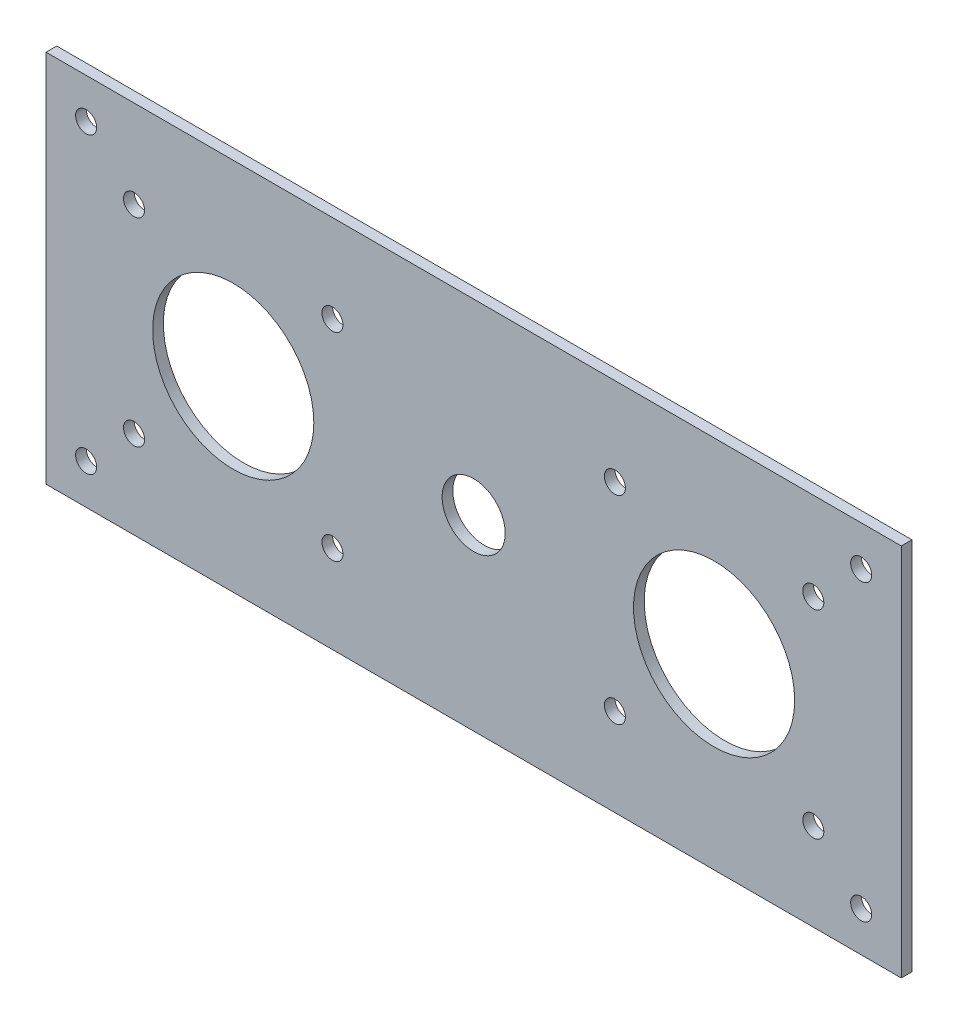
ISO-10303-21;
HEADER;
FILE_DESCRIPTION(('STEP AP214'),'2;1');
FILE_NAME('part.step','',(''),(''),'','','');
FILE_SCHEMA(('AUTOMOTIVE_DESIGN { 1 0 10303 214 1 1 1 1 }'));
ENDSEC;
DATA;
#1=APPLICATION_CONTEXT('core data for automotive mechanical design processes');
#2=APPLICATION_PROTOCOL_DEFINITION('international standard','automotive_design',2000,#1);
#3=PRODUCT_CONTEXT('',#1,'mechanical');
#4=PRODUCT('Part','Part','',(#3));
#5=PRODUCT_RELATED_PRODUCT_CATEGORY('part','',(#4));
#6=PRODUCT_DEFINITION_FORMATION('','',#4);
#7=PRODUCT_DEFINITION_CONTEXT('part definition',#1,'design');
#8=PRODUCT_DEFINITION('design','',#6,#7);
#9=PRODUCT_DEFINITION_SHAPE('','',#8);
#10=(LENGTH_UNIT() NAMED_UNIT(*) SI_UNIT(.MILLI.,.METRE.));
#11=(NAMED_UNIT(*) PLANE_ANGLE_UNIT() SI_UNIT($,.RADIAN.));
#12=(NAMED_UNIT(*) SI_UNIT($,.STERADIAN.) SOLID_ANGLE_UNIT());
#13=UNCERTAINTY_MEASURE_WITH_UNIT(LENGTH_MEASURE(1.E-05),#10,'distance_accuracy_value','');
#14=(GEOMETRIC_REPRESENTATION_CONTEXT(3) GLOBAL_UNCERTAINTY_ASSIGNED_CONTEXT((#13)) GLOBAL_UNIT_ASSIGNED_CONTEXT((#10,
#11,#12)) REPRESENTATION_CONTEXT('',''));
#15=CARTESIAN_POINT('',(0.,0.,0.));
#16=DIRECTION('',(0.,0.,1.));
#17=DIRECTION('',(1.,0.,0.));
#18=AXIS2_PLACEMENT_3D('',#15,#16,#17);
#19=CARTESIAN_POINT('',(0.,0.,1.27));
#20=DIRECTION('',(0.,0.,-1.));
#21=DIRECTION('',(-1.,0.,0.));
#22=AXIS2_PLACEMENT_3D('',#19,#20,#21);
#23=PLANE('',#22);
#24=CARTESIAN_POINT('',(0.,0.,1.27));
#25=DIRECTION('',(0.,0.,-1.));
#26=DIRECTION('',(-1.,0.,0.));
#27=AXIS2_PLACEMENT_3D('',#24,#25,#26);
#28=CIRCLE('',#27,7.50000000000001);
#29=CARTESIAN_POINT('',(-7.50000000000001,0.,1.27));
#30=VERTEX_POINT('',#29);
#31=EDGE_CURVE('E238',#30,#30,#28,.T.);
#32=ORIENTED_EDGE('',*,*,#31,.T.);
#33=EDGE_LOOP('',(#32));
#34=FACE_BOUND('',#33,.T.);
#35=CARTESIAN_POINT('',(-92.075,34.925,1.27));
#36=DIRECTION('',(0.,0.,1.));
#37=DIRECTION('',(1.,0.,0.));
#38=AXIS2_PLACEMENT_3D('',#35,#36,#37);
#39=CIRCLE('',#38,2.5);
#40=CARTESIAN_POINT('',(-89.575,34.925,1.27));
#41=VERTEX_POINT('',#40);
#42=EDGE_CURVE('E227',#41,#41,#39,.T.);
#43=ORIENTED_EDGE('',*,*,#42,.F.);
#44=EDGE_LOOP('',(#43));
#45=FACE_BOUND('',#44,.T.);
#46=CARTESIAN_POINT('',(92.075,-34.925,1.27));
#47=DIRECTION('',(0.,0.,1.));
#48=DIRECTION('',(1.,0.,0.));
#49=AXIS2_PLACEMENT_3D('',#46,#47,#48);
#50=CIRCLE('',#49,2.5);
#51=CARTESIAN_POINT('',(94.575,-34.925,1.27));
#52=VERTEX_POINT('',#51);
#53=EDGE_CURVE('E218',#52,#52,#50,.T.);
#54=ORIENTED_EDGE('',*,*,#53,.F.);
#55=EDGE_LOOP('',(#54));
#56=FACE_BOUND('',#55,.T.);
#57=CARTESIAN_POINT('',(92.075,34.925,1.27));
#58=DIRECTION('',(0.,0.,1.));
#59=DIRECTION('',(1.,0.,0.));
#60=AXIS2_PLACEMENT_3D('',#57,#58,#59);
#61=CIRCLE('',#60,2.50000000000001);
#62=CARTESIAN_POINT('',(94.575,34.925,1.27));
#63=VERTEX_POINT('',#62);
#64=EDGE_CURVE('E234',#63,#63,#61,.T.);
#65=ORIENTED_EDGE('',*,*,#64,.F.);
#66=EDGE_LOOP('',(#65));
#67=FACE_BOUND('',#66,.T.);
#68=CARTESIAN_POINT('',(-92.075,-34.925,1.27));
#69=DIRECTION('',(0.,0.,1.));
#70=DIRECTION('',(1.,0.,0.));
#71=AXIS2_PLACEMENT_3D('',#68,#69,#70);
#72=CIRCLE('',#71,2.5);
#73=CARTESIAN_POINT('',(-89.575,-34.925,1.27));
#74=VERTEX_POINT('',#73);
#75=EDGE_CURVE('E210',#74,#74,#72,.T.);
#76=ORIENTED_EDGE('',*,*,#75,.F.);
#77=EDGE_LOOP('',(#76));
#78=FACE_BOUND('',#77,.T.);
#79=DIRECTION('',(0.,1.,0.));
#80=VECTOR('',#79,1.);
#81=CARTESIAN_POINT('',(101.6,-44.45,1.27));
#82=LINE('',#81,#80);
#83=CARTESIAN_POINT('',(101.6,-44.45,1.27));
#84=VERTEX_POINT('',#83);
#85=CARTESIAN_POINT('',(101.6,44.45,1.27));
#86=VERTEX_POINT('',#85);
#87=EDGE_CURVE('E92',#84,#86,#82,.T.);
#88=ORIENTED_EDGE('',*,*,#87,.T.);
#89=DIRECTION('',(-1.,0.,0.));
#90=VECTOR('',#89,1.);
#91=CARTESIAN_POINT('',(-101.6,44.45,1.27));
#92=LINE('',#91,#90);
#93=CARTESIAN_POINT('',(-101.6,44.45,1.27));
#94=VERTEX_POINT('',#93);
#95=EDGE_CURVE('E87',#86,#94,#92,.T.);
#96=ORIENTED_EDGE('',*,*,#95,.T.);
#97=DIRECTION('',(0.,-1.,0.));
#98=VECTOR('',#97,1.);
#99=CARTESIAN_POINT('',(-101.6,-44.45,1.27));
#100=LINE('',#99,#98);
#101=CARTESIAN_POINT('',(-101.6,-44.45,1.27));
#102=VERTEX_POINT('',#101);
#103=EDGE_CURVE('E90',#94,#102,#100,.T.);
#104=ORIENTED_EDGE('',*,*,#103,.T.);
#105=DIRECTION('',(1.,0.,0.));
#106=VECTOR('',#105,1.);
#107=CARTESIAN_POINT('',(-101.6,-44.45,1.27));
#108=LINE('',#107,#106);
#109=EDGE_CURVE('E57',#102,#84,#108,.T.);
#110=ORIENTED_EDGE('',*,*,#109,.T.);
#111=EDGE_LOOP('',(#88,#96,#104,#110));
#112=FACE_BOUND('',#111,.T.);
#113=CARTESIAN_POINT('',(-80.695,-23.57,1.27));
#114=DIRECTION('',(0.,0.,1.));
#115=DIRECTION('',(1.,0.,0.));
#116=AXIS2_PLACEMENT_3D('',#113,#114,#115);
#117=CIRCLE('',#116,2.50000000000002);
#118=CARTESIAN_POINT('',(-78.195,-23.57,1.27));
#119=VERTEX_POINT('',#118);
#120=EDGE_CURVE('E112',#119,#119,#117,.T.);
#121=ORIENTED_EDGE('',*,*,#120,.F.);
#122=EDGE_LOOP('',(#121));
#123=FACE_BOUND('',#122,.T.);
#124=CARTESIAN_POINT('',(-33.555,-23.57,1.27));
#125=DIRECTION('',(0.,0.,1.));
#126=DIRECTION('',(1.,0.,0.));
#127=AXIS2_PLACEMENT_3D('',#124,#125,#126);
#128=CIRCLE('',#127,2.50000000000002);
#129=CARTESIAN_POINT('',(-31.055,-23.57,1.27));
#130=VERTEX_POINT('',#129);
#131=EDGE_CURVE('E134',#130,#130,#128,.T.);
#132=ORIENTED_EDGE('',*,*,#131,.F.);
#133=EDGE_LOOP('',(#132));
#134=FACE_BOUND('',#133,.T.);
#135=CARTESIAN_POINT('',(-33.555,23.57,1.27));
#136=DIRECTION('',(0.,0.,1.));
#137=DIRECTION('',(1.,0.,0.));
#138=AXIS2_PLACEMENT_3D('',#135,#136,#137);
#139=CIRCLE('',#138,2.50000000000002);
#140=CARTESIAN_POINT('',(-31.055,23.57,1.27));
#141=VERTEX_POINT('',#140);
#142=EDGE_CURVE('E142',#141,#141,#139,.T.);
#143=ORIENTED_EDGE('',*,*,#142,.F.);
#144=EDGE_LOOP('',(#143));
#145=FACE_BOUND('',#144,.T.);
#146=CARTESIAN_POINT('',(-80.695,23.57,1.27));
#147=DIRECTION('',(0.,0.,1.));
#148=DIRECTION('',(1.,0.,0.));
#149=AXIS2_PLACEMENT_3D('',#146,#147,#148);
#150=CIRCLE('',#149,2.50000000000002);
#151=CARTESIAN_POINT('',(-78.195,23.57,1.27));
#152=VERTEX_POINT('',#151);
#153=EDGE_CURVE('E150',#152,#152,#150,.T.);
#154=ORIENTED_EDGE('',*,*,#153,.F.);
#155=EDGE_LOOP('',(#154));
#156=FACE_BOUND('',#155,.T.);
#157=CARTESIAN_POINT('',(80.695,23.57,1.27));
#158=DIRECTION('',(0.,0.,1.));
#159=DIRECTION('',(1.,0.,0.));
#160=AXIS2_PLACEMENT_3D('',#157,#158,#159);
#161=CIRCLE('',#160,2.50000000000001);
#162=CARTESIAN_POINT('',(83.195,23.57,1.27));
#163=VERTEX_POINT('',#162);
#164=EDGE_CURVE('E158',#163,#163,#161,.T.);
#165=ORIENTED_EDGE('',*,*,#164,.F.);
#166=EDGE_LOOP('',(#165));
#167=FACE_BOUND('',#166,.T.);
#168=CARTESIAN_POINT('',(33.555,23.57,1.27));
#169=DIRECTION('',(0.,0.,1.));
#170=DIRECTION('',(1.,0.,0.));
#171=AXIS2_PLACEMENT_3D('',#168,#169,#170);
#172=CIRCLE('',#171,2.49999999999999);
#173=CARTESIAN_POINT('',(36.055,23.57,1.27));
#174=VERTEX_POINT('',#173);
#175=EDGE_CURVE('E166',#174,#174,#172,.T.);
#176=ORIENTED_EDGE('',*,*,#175,.F.);
#177=EDGE_LOOP('',(#176));
#178=FACE_BOUND('',#177,.T.);
#179=CARTESIAN_POINT('',(80.695,-23.57,1.27));
#180=DIRECTION('',(0.,0.,1.));
#181=DIRECTION('',(1.,0.,0.));
#182=AXIS2_PLACEMENT_3D('',#179,#180,#181);
#183=CIRCLE('',#182,2.5);
#184=CARTESIAN_POINT('',(83.195,-23.57,1.27));
#185=VERTEX_POINT('',#184);
#186=EDGE_CURVE('E174',#185,#185,#183,.T.);
#187=ORIENTED_EDGE('',*,*,#186,.F.);
#188=EDGE_LOOP('',(#187));
#189=FACE_BOUND('',#188,.T.);
#190=CARTESIAN_POINT('',(33.555,-23.57,1.27));
#191=DIRECTION('',(0.,0.,1.));
#192=DIRECTION('',(1.,0.,0.));
#193=AXIS2_PLACEMENT_3D('',#190,#191,#192);
#194=CIRCLE('',#193,2.49999999999999);
#195=CARTESIAN_POINT('',(36.055,-23.57,1.27));
#196=VERTEX_POINT('',#195);
#197=EDGE_CURVE('E182',#196,#196,#194,.T.);
#198=ORIENTED_EDGE('',*,*,#197,.F.);
#199=EDGE_LOOP('',(#198));
#200=FACE_BOUND('',#199,.T.);
#201=CARTESIAN_POINT('',(-57.125,0.,1.27));
#202=DIRECTION('',(0.,0.,1.));
#203=DIRECTION('',(1.,0.,0.));
#204=AXIS2_PLACEMENT_3D('',#201,#202,#203);
#205=CIRCLE('',#204,19.15);
#206=CARTESIAN_POINT('',(-37.975,0.,1.27));
#207=VERTEX_POINT('',#206);
#208=EDGE_CURVE('E190',#207,#207,#205,.T.);
#209=ORIENTED_EDGE('',*,*,#208,.F.);
#210=EDGE_LOOP('',(#209));
#211=FACE_BOUND('',#210,.T.);
#212=CARTESIAN_POINT('',(57.125,0.,1.27));
#213=DIRECTION('',(0.,0.,1.));
#214=DIRECTION('',(1.,0.,0.));
#215=AXIS2_PLACEMENT_3D('',#212,#213,#214);
#216=CIRCLE('',#215,19.15);
#217=CARTESIAN_POINT('',(76.275,0.,1.27));
#218=VERTEX_POINT('',#217);
#219=EDGE_CURVE('E198',#218,#218,#216,.T.);
#220=ORIENTED_EDGE('',*,*,#219,.F.);
#221=EDGE_LOOP('',(#220));
#222=FACE_BOUND('',#221,.T.);
#223=ADVANCED_FACE('F39',(#34,#45,#56,#67,#78,#112,#123,#134,#145,#156,#167,#178,#189,#200,#211,
#222),#23,.F.);
#224=CARTESIAN_POINT('',(0.,0.,-1.27));
#225=DIRECTION('',(0.,0.,-1.));
#226=DIRECTION('',(-1.,0.,0.));
#227=AXIS2_PLACEMENT_3D('',#224,#225,#226);
#228=PLANE('',#227);
#229=CARTESIAN_POINT('',(0.,0.,-1.27));
#230=DIRECTION('',(0.,0.,1.));
#231=DIRECTION('',(1.,0.,0.));
#232=AXIS2_PLACEMENT_3D('',#229,#230,#231);
#233=CIRCLE('',#232,7.50000000000001);
#234=CARTESIAN_POINT('',(7.50000000000001,0.,-1.27));
#235=VERTEX_POINT('',#234);
#236=EDGE_CURVE('E245',#235,#235,#233,.T.);
#237=ORIENTED_EDGE('',*,*,#236,.T.);
#238=EDGE_LOOP('',(#237));
#239=FACE_BOUND('',#238,.T.);
#240=CARTESIAN_POINT('',(-92.075,34.925,-1.27));
#241=DIRECTION('',(0.,0.,1.));
#242=DIRECTION('',(1.,0.,0.));
#243=AXIS2_PLACEMENT_3D('',#240,#241,#242);
#244=CIRCLE('',#243,2.5);
#245=CARTESIAN_POINT('',(-89.575,34.925,-1.27));
#246=VERTEX_POINT('',#245);
#247=EDGE_CURVE('E214',#246,#246,#244,.T.);
#248=ORIENTED_EDGE('',*,*,#247,.T.);
#249=EDGE_LOOP('',(#248));
#250=FACE_BOUND('',#249,.T.);
#251=CARTESIAN_POINT('',(92.075,-34.925,-1.27));
#252=DIRECTION('',(0.,0.,1.));
#253=DIRECTION('',(1.,0.,0.));
#254=AXIS2_PLACEMENT_3D('',#251,#252,#253);
#255=CIRCLE('',#254,2.5);
#256=CARTESIAN_POINT('',(94.575,-34.925,-1.27));
#257=VERTEX_POINT('',#256);
#258=EDGE_CURVE('E222',#257,#257,#255,.T.);
#259=ORIENTED_EDGE('',*,*,#258,.T.);
#260=EDGE_LOOP('',(#259));
#261=FACE_BOUND('',#260,.T.);
#262=CARTESIAN_POINT('',(92.075,34.925,-1.27));
#263=DIRECTION('',(0.,0.,1.));
#264=DIRECTION('',(1.,0.,0.));
#265=AXIS2_PLACEMENT_3D('',#262,#263,#264);
#266=CIRCLE('',#265,2.50000000000001);
#267=CARTESIAN_POINT('',(94.575,34.925,-1.27));
#268=VERTEX_POINT('',#267);
#269=EDGE_CURVE('E223',#268,#268,#266,.T.);
#270=ORIENTED_EDGE('',*,*,#269,.T.);
#271=EDGE_LOOP('',(#270));
#272=FACE_BOUND('',#271,.T.);
#273=CARTESIAN_POINT('',(-92.075,-34.925,-1.27));
#274=DIRECTION('',(0.,0.,1.));
#275=DIRECTION('',(1.,0.,0.));
#276=AXIS2_PLACEMENT_3D('',#273,#274,#275);
#277=CIRCLE('',#276,2.5);
#278=CARTESIAN_POINT('',(-89.575,-34.925,-1.27));
#279=VERTEX_POINT('',#278);
#280=EDGE_CURVE('E206',#279,#279,#277,.T.);
#281=ORIENTED_EDGE('',*,*,#280,.T.);
#282=EDGE_LOOP('',(#281));
#283=FACE_BOUND('',#282,.T.);
#284=CARTESIAN_POINT('',(-57.125,0.,-1.27));
#285=DIRECTION('',(0.,0.,1.));
#286=DIRECTION('',(1.,0.,0.));
#287=AXIS2_PLACEMENT_3D('',#284,#285,#286);
#288=CIRCLE('',#287,19.15);
#289=CARTESIAN_POINT('',(-37.975,0.,-1.27));
#290=VERTEX_POINT('',#289);
#291=EDGE_CURVE('E194',#290,#290,#288,.T.);
#292=ORIENTED_EDGE('',*,*,#291,.T.);
#293=EDGE_LOOP('',(#292));
#294=FACE_BOUND('',#293,.T.);
#295=CARTESIAN_POINT('',(80.695,-23.57,-1.27));
#296=DIRECTION('',(0.,0.,1.));
#297=DIRECTION('',(1.,0.,0.));
#298=AXIS2_PLACEMENT_3D('',#295,#296,#297);
#299=CIRCLE('',#298,2.5);
#300=CARTESIAN_POINT('',(83.195,-23.57,-1.27));
#301=VERTEX_POINT('',#300);
#302=EDGE_CURVE('E178',#301,#301,#299,.T.);
#303=ORIENTED_EDGE('',*,*,#302,.T.);
#304=EDGE_LOOP('',(#303));
#305=FACE_BOUND('',#304,.T.);
#306=CARTESIAN_POINT('',(80.695,23.57,-1.27));
#307=DIRECTION('',(0.,0.,1.));
#308=DIRECTION('',(1.,0.,0.));
#309=AXIS2_PLACEMENT_3D('',#306,#307,#308);
#310=CIRCLE('',#309,2.50000000000001);
#311=CARTESIAN_POINT('',(83.195,23.57,-1.27));
#312=VERTEX_POINT('',#311);
#313=EDGE_CURVE('E162',#312,#312,#310,.T.);
#314=ORIENTED_EDGE('',*,*,#313,.T.);
#315=EDGE_LOOP('',(#314));
#316=FACE_BOUND('',#315,.T.);
#317=CARTESIAN_POINT('',(-33.555,23.57,-1.27));
#318=DIRECTION('',(0.,0.,1.));
#319=DIRECTION('',(1.,0.,0.));
#320=AXIS2_PLACEMENT_3D('',#317,#318,#319);
#321=CIRCLE('',#320,2.50000000000002);
#322=CARTESIAN_POINT('',(-31.055,23.57,-1.27));
#323=VERTEX_POINT('',#322);
#324=EDGE_CURVE('E146',#323,#323,#321,.T.);
#325=ORIENTED_EDGE('',*,*,#324,.T.);
#326=EDGE_LOOP('',(#325));
#327=FACE_BOUND('',#326,.T.);
#328=CARTESIAN_POINT('',(-80.695,-23.57,-1.27));
#329=DIRECTION('',(0.,0.,1.));
#330=DIRECTION('',(1.,0.,0.));
#331=AXIS2_PLACEMENT_3D('',#328,#329,#330);
#332=CIRCLE('',#331,2.50000000000002);
#333=CARTESIAN_POINT('',(-78.195,-23.57,-1.27));
#334=VERTEX_POINT('',#333);
#335=EDGE_CURVE('E130',#334,#334,#332,.T.);
#336=ORIENTED_EDGE('',*,*,#335,.T.);
#337=EDGE_LOOP('',(#336));
#338=FACE_BOUND('',#337,.T.);
#339=DIRECTION('',(0.,1.,0.));
#340=VECTOR('',#339,1.);
#341=CARTESIAN_POINT('',(101.6,-44.45,-1.27));
#342=LINE('',#341,#340);
#343=CARTESIAN_POINT('',(101.6,-44.45,-1.27));
#344=VERTEX_POINT('',#343);
#345=CARTESIAN_POINT('',(101.6,44.45,-1.27));
#346=VERTEX_POINT('',#345);
#347=EDGE_CURVE('E108',#344,#346,#342,.T.);
#348=ORIENTED_EDGE('',*,*,#347,.F.);
#349=DIRECTION('',(1.,0.,0.));
#350=VECTOR('',#349,1.);
#351=CARTESIAN_POINT('',(-101.6,-44.45,-1.27));
#352=LINE('',#351,#350);
#353=CARTESIAN_POINT('',(-101.6,-44.45,-1.27));
#354=VERTEX_POINT('',#353);
#355=EDGE_CURVE('E80',#354,#344,#352,.T.);
#356=ORIENTED_EDGE('',*,*,#355,.F.);
#357=DIRECTION('',(0.,-1.,0.));
#358=VECTOR('',#357,1.);
#359=CARTESIAN_POINT('',(-101.6,-44.45,-1.27));
#360=LINE('',#359,#358);
#361=CARTESIAN_POINT('',(-101.6,44.45,-1.27));
#362=VERTEX_POINT('',#361);
#363=EDGE_CURVE('E74',#362,#354,#360,.T.);
#364=ORIENTED_EDGE('',*,*,#363,.F.);
#365=DIRECTION('',(-1.,0.,0.));
#366=VECTOR('',#365,1.);
#367=CARTESIAN_POINT('',(-101.6,44.45,-1.27));
#368=LINE('',#367,#366);
#369=EDGE_CURVE('E97',#346,#362,#368,.T.);
#370=ORIENTED_EDGE('',*,*,#369,.F.);
#371=EDGE_LOOP('',(#348,#356,#364,#370));
#372=FACE_BOUND('',#371,.T.);
#373=CARTESIAN_POINT('',(-33.555,-23.57,-1.27));
#374=DIRECTION('',(0.,0.,1.));
#375=DIRECTION('',(1.,0.,0.));
#376=AXIS2_PLACEMENT_3D('',#373,#374,#375);
#377=CIRCLE('',#376,2.50000000000002);
#378=CARTESIAN_POINT('',(-31.055,-23.57,-1.27));
#379=VERTEX_POINT('',#378);
#380=EDGE_CURVE('E138',#379,#379,#377,.T.);
#381=ORIENTED_EDGE('',*,*,#380,.T.);
#382=EDGE_LOOP('',(#381));
#383=FACE_BOUND('',#382,.T.);
#384=CARTESIAN_POINT('',(-80.695,23.57,-1.27));
#385=DIRECTION('',(0.,0.,1.));
#386=DIRECTION('',(1.,0.,0.));
#387=AXIS2_PLACEMENT_3D('',#384,#385,#386);
#388=CIRCLE('',#387,2.50000000000002);
#389=CARTESIAN_POINT('',(-78.195,23.57,-1.27));
#390=VERTEX_POINT('',#389);
#391=EDGE_CURVE('E154',#390,#390,#388,.T.);
#392=ORIENTED_EDGE('',*,*,#391,.T.);
#393=EDGE_LOOP('',(#392));
#394=FACE_BOUND('',#393,.T.);
#395=CARTESIAN_POINT('',(33.555,23.57,-1.27));
#396=DIRECTION('',(0.,0.,1.));
#397=DIRECTION('',(1.,0.,0.));
#398=AXIS2_PLACEMENT_3D('',#395,#396,#397);
#399=CIRCLE('',#398,2.49999999999999);
#400=CARTESIAN_POINT('',(36.055,23.57,-1.27));
#401=VERTEX_POINT('',#400);
#402=EDGE_CURVE('E170',#401,#401,#399,.T.);
#403=ORIENTED_EDGE('',*,*,#402,.T.);
#404=EDGE_LOOP('',(#403));
#405=FACE_BOUND('',#404,.T.);
#406=CARTESIAN_POINT('',(33.555,-23.57,-1.27));
#407=DIRECTION('',(0.,0.,1.));
#408=DIRECTION('',(1.,0.,0.));
#409=AXIS2_PLACEMENT_3D('',#406,#407,#408);
#410=CIRCLE('',#409,2.49999999999999);
#411=CARTESIAN_POINT('',(36.055,-23.57,-1.27));
#412=VERTEX_POINT('',#411);
#413=EDGE_CURVE('E186',#412,#412,#410,.T.);
#414=ORIENTED_EDGE('',*,*,#413,.T.);
#415=EDGE_LOOP('',(#414));
#416=FACE_BOUND('',#415,.T.);
#417=CARTESIAN_POINT('',(57.125,0.,-1.27));
#418=DIRECTION('',(0.,0.,1.));
#419=DIRECTION('',(1.,0.,0.));
#420=AXIS2_PLACEMENT_3D('',#417,#418,#419);
#421=CIRCLE('',#420,19.15);
#422=CARTESIAN_POINT('',(76.275,0.,-1.27));
#423=VERTEX_POINT('',#422);
#424=EDGE_CURVE('E202',#423,#423,#421,.T.);
#425=ORIENTED_EDGE('',*,*,#424,.T.);
#426=EDGE_LOOP('',(#425));
#427=FACE_BOUND('',#426,.T.);
#428=ADVANCED_FACE('F125',(#239,#250,#261,#272,#283,#294,#305,#316,#327,#338,#372,#383,#394,
#405,#416,#427),#228,.T.);
#429=CARTESIAN_POINT('',(101.6,-44.45,1.27));
#430=DIRECTION('',(-1.,0.,0.));
#431=DIRECTION('',(0.,0.,1.));
#432=AXIS2_PLACEMENT_3D('',#429,#430,#431);
#433=PLANE('',#432);
#434=ORIENTED_EDGE('',*,*,#347,.T.);
#435=DIRECTION('',(0.,0.,-1.));
#436=VECTOR('',#435,1.);
#437=CARTESIAN_POINT('',(101.6,44.45,1.27));
#438=LINE('',#437,#436);
#439=EDGE_CURVE('E11',#86,#346,#438,.T.);
#440=ORIENTED_EDGE('',*,*,#439,.F.);
#441=ORIENTED_EDGE('',*,*,#87,.F.);
#442=DIRECTION('',(0.,0.,-1.));
#443=VECTOR('',#442,1.);
#444=CARTESIAN_POINT('',(101.6,-44.45,1.27));
#445=LINE('',#444,#443);
#446=EDGE_CURVE('E104',#84,#344,#445,.T.);
#447=ORIENTED_EDGE('',*,*,#446,.T.);
#448=EDGE_LOOP('',(#434,#440,#441,#447));
#449=FACE_BOUND('',#448,.T.);
#450=ADVANCED_FACE('F41',(#449),#433,.F.);
#451=CARTESIAN_POINT('',(-101.6,44.45,1.27));
#452=DIRECTION('',(0.,-1.,0.));
#453=DIRECTION('',(0.,0.,-1.));
#454=AXIS2_PLACEMENT_3D('',#451,#452,#453);
#455=PLANE('',#454);
#456=ORIENTED_EDGE('',*,*,#369,.T.);
#457=DIRECTION('',(0.,0.,-1.));
#458=VECTOR('',#457,1.);
#459=CARTESIAN_POINT('',(-101.6,44.45,1.27));
#460=LINE('',#459,#458);
#461=EDGE_CURVE('E49',#94,#362,#460,.T.);
#462=ORIENTED_EDGE('',*,*,#461,.F.);
#463=ORIENTED_EDGE('',*,*,#95,.F.);
#464=ORIENTED_EDGE('',*,*,#439,.T.);
#465=EDGE_LOOP('',(#456,#462,#463,#464));
#466=FACE_BOUND('',#465,.T.);
#467=ADVANCED_FACE('F96',(#466),#455,.F.);
#468=CARTESIAN_POINT('',(-101.6,-44.45,1.27));
#469=DIRECTION('',(1.,0.,0.));
#470=DIRECTION('',(0.,0.,-1.));
#471=AXIS2_PLACEMENT_3D('',#468,#469,#470);
#472=PLANE('',#471);
#473=ORIENTED_EDGE('',*,*,#363,.T.);
#474=DIRECTION('',(0.,0.,-1.));
#475=VECTOR('',#474,1.);
#476=CARTESIAN_POINT('',(-101.6,-44.45,1.27));
#477=LINE('',#476,#475);
#478=EDGE_CURVE('E99',#102,#354,#477,.T.);
#479=ORIENTED_EDGE('',*,*,#478,.F.);
#480=ORIENTED_EDGE('',*,*,#103,.F.);
#481=ORIENTED_EDGE('',*,*,#461,.T.);
#482=EDGE_LOOP('',(#473,#479,#480,#481));
#483=FACE_BOUND('',#482,.T.);
#484=ADVANCED_FACE('F100',(#483),#472,.F.);
#485=CARTESIAN_POINT('',(-101.6,-44.45,1.27));
#486=DIRECTION('',(0.,1.,0.));
#487=DIRECTION('',(0.,0.,1.));
#488=AXIS2_PLACEMENT_3D('',#485,#486,#487);
#489=PLANE('',#488);
#490=ORIENTED_EDGE('',*,*,#355,.T.);
#491=ORIENTED_EDGE('',*,*,#446,.F.);
#492=ORIENTED_EDGE('',*,*,#109,.F.);
#493=ORIENTED_EDGE('',*,*,#478,.T.);
#494=EDGE_LOOP('',(#490,#491,#492,#493));
#495=FACE_BOUND('',#494,.T.);
#496=ADVANCED_FACE('F122',(#495),#489,.F.);
#497=CARTESIAN_POINT('',(-80.695,-23.57,1.27));
#498=DIRECTION('',(0.,0.,-1.));
#499=DIRECTION('',(-1.,0.,0.));
#500=AXIS2_PLACEMENT_3D('',#497,#498,#499);
#501=CYLINDRICAL_SURFACE('',#500,2.50000000000002);
#502=ORIENTED_EDGE('',*,*,#120,.T.);
#503=EDGE_LOOP('',(#502));
#504=FACE_BOUND('',#503,.T.);
#505=ORIENTED_EDGE('',*,*,#335,.F.);
#506=EDGE_LOOP('',(#505));
#507=FACE_BOUND('',#506,.T.);
#508=ADVANCED_FACE('F320',(#504,#507),#501,.F.);
#509=CARTESIAN_POINT('',(-33.555,-23.57,1.27));
#510=DIRECTION('',(0.,0.,-1.));
#511=DIRECTION('',(-1.,0.,0.));
#512=AXIS2_PLACEMENT_3D('',#509,#510,#511);
#513=CYLINDRICAL_SURFACE('',#512,2.50000000000002);
#514=ORIENTED_EDGE('',*,*,#131,.T.);
#515=EDGE_LOOP('',(#514));
#516=FACE_BOUND('',#515,.T.);
#517=ORIENTED_EDGE('',*,*,#380,.F.);
#518=EDGE_LOOP('',(#517));
#519=FACE_BOUND('',#518,.T.);
#520=ADVANCED_FACE('F316',(#516,#519),#513,.F.);
#521=CARTESIAN_POINT('',(-33.555,23.57,1.27));
#522=DIRECTION('',(0.,0.,-1.));
#523=DIRECTION('',(-1.,0.,0.));
#524=AXIS2_PLACEMENT_3D('',#521,#522,#523);
#525=CYLINDRICAL_SURFACE('',#524,2.50000000000002);
#526=ORIENTED_EDGE('',*,*,#142,.T.);
#527=EDGE_LOOP('',(#526));
#528=FACE_BOUND('',#527,.T.);
#529=ORIENTED_EDGE('',*,*,#324,.F.);
#530=EDGE_LOOP('',(#529));
#531=FACE_BOUND('',#530,.T.);
#532=ADVANCED_FACE('F312',(#528,#531),#525,.F.);
#533=CARTESIAN_POINT('',(-80.695,23.57,1.27));
#534=DIRECTION('',(0.,0.,-1.));
#535=DIRECTION('',(-1.,0.,0.));
#536=AXIS2_PLACEMENT_3D('',#533,#534,#535);
#537=CYLINDRICAL_SURFACE('',#536,2.50000000000002);
#538=ORIENTED_EDGE('',*,*,#153,.T.);
#539=EDGE_LOOP('',(#538));
#540=FACE_BOUND('',#539,.T.);
#541=ORIENTED_EDGE('',*,*,#391,.F.);
#542=EDGE_LOOP('',(#541));
#543=FACE_BOUND('',#542,.T.);
#544=ADVANCED_FACE('F308',(#540,#543),#537,.F.);
#545=CARTESIAN_POINT('',(80.695,23.57,1.27));
#546=DIRECTION('',(0.,0.,-1.));
#547=DIRECTION('',(-1.,0.,0.));
#548=AXIS2_PLACEMENT_3D('',#545,#546,#547);
#549=CYLINDRICAL_SURFACE('',#548,2.50000000000001);
#550=ORIENTED_EDGE('',*,*,#164,.T.);
#551=EDGE_LOOP('',(#550));
#552=FACE_BOUND('',#551,.T.);
#553=ORIENTED_EDGE('',*,*,#313,.F.);
#554=EDGE_LOOP('',(#553));
#555=FACE_BOUND('',#554,.T.);
#556=ADVANCED_FACE('F304',(#552,#555),#549,.F.);
#557=CARTESIAN_POINT('',(33.555,23.57,1.27));
#558=DIRECTION('',(0.,0.,-1.));
#559=DIRECTION('',(-1.,0.,0.));
#560=AXIS2_PLACEMENT_3D('',#557,#558,#559);
#561=CYLINDRICAL_SURFACE('',#560,2.49999999999999);
#562=ORIENTED_EDGE('',*,*,#175,.T.);
#563=EDGE_LOOP('',(#562));
#564=FACE_BOUND('',#563,.T.);
#565=ORIENTED_EDGE('',*,*,#402,.F.);
#566=EDGE_LOOP('',(#565));
#567=FACE_BOUND('',#566,.T.);
#568=ADVANCED_FACE('F300',(#564,#567),#561,.F.);
#569=CARTESIAN_POINT('',(80.695,-23.57,1.27));
#570=DIRECTION('',(0.,0.,-1.));
#571=DIRECTION('',(-1.,0.,0.));
#572=AXIS2_PLACEMENT_3D('',#569,#570,#571);
#573=CYLINDRICAL_SURFACE('',#572,2.5);
#574=ORIENTED_EDGE('',*,*,#186,.T.);
#575=EDGE_LOOP('',(#574));
#576=FACE_BOUND('',#575,.T.);
#577=ORIENTED_EDGE('',*,*,#302,.F.);
#578=EDGE_LOOP('',(#577));
#579=FACE_BOUND('',#578,.T.);
#580=ADVANCED_FACE('F296',(#576,#579),#573,.F.);
#581=CARTESIAN_POINT('',(33.555,-23.57,1.27));
#582=DIRECTION('',(0.,0.,-1.));
#583=DIRECTION('',(-1.,0.,0.));
#584=AXIS2_PLACEMENT_3D('',#581,#582,#583);
#585=CYLINDRICAL_SURFACE('',#584,2.49999999999999);
#586=ORIENTED_EDGE('',*,*,#197,.T.);
#587=EDGE_LOOP('',(#586));
#588=FACE_BOUND('',#587,.T.);
#589=ORIENTED_EDGE('',*,*,#413,.F.);
#590=EDGE_LOOP('',(#589));
#591=FACE_BOUND('',#590,.T.);
#592=ADVANCED_FACE('F292',(#588,#591),#585,.F.);
#593=CARTESIAN_POINT('',(-57.125,0.,1.27));
#594=DIRECTION('',(0.,0.,-1.));
#595=DIRECTION('',(-1.,0.,0.));
#596=AXIS2_PLACEMENT_3D('',#593,#594,#595);
#597=CYLINDRICAL_SURFACE('',#596,19.15);
#598=ORIENTED_EDGE('',*,*,#208,.T.);
#599=EDGE_LOOP('',(#598));
#600=FACE_BOUND('',#599,.T.);
#601=ORIENTED_EDGE('',*,*,#291,.F.);
#602=EDGE_LOOP('',(#601));
#603=FACE_BOUND('',#602,.T.);
#604=ADVANCED_FACE('F283',(#600,#603),#597,.F.);
#605=CARTESIAN_POINT('',(57.125,0.,1.27));
#606=DIRECTION('',(0.,0.,-1.));
#607=DIRECTION('',(-1.,0.,0.));
#608=AXIS2_PLACEMENT_3D('',#605,#606,#607);
#609=CYLINDRICAL_SURFACE('',#608,19.15);
#610=ORIENTED_EDGE('',*,*,#219,.T.);
#611=EDGE_LOOP('',(#610));
#612=FACE_BOUND('',#611,.T.);
#613=ORIENTED_EDGE('',*,*,#424,.F.);
#614=EDGE_LOOP('',(#613));
#615=FACE_BOUND('',#614,.T.);
#616=ADVANCED_FACE('F273',(#612,#615),#609,.F.);
#617=CARTESIAN_POINT('',(-92.075,-34.925,-1.27));
#618=DIRECTION('',(0.,0.,1.));
#619=DIRECTION('',(1.,0.,0.));
#620=AXIS2_PLACEMENT_3D('',#617,#618,#619);
#621=CYLINDRICAL_SURFACE('',#620,2.5);
#622=ORIENTED_EDGE('',*,*,#280,.F.);
#623=EDGE_LOOP('',(#622));
#624=FACE_BOUND('',#623,.T.);
#625=ORIENTED_EDGE('',*,*,#75,.T.);
#626=EDGE_LOOP('',(#625));
#627=FACE_BOUND('',#626,.T.);
#628=ADVANCED_FACE('F270',(#624,#627),#621,.F.);
#629=CARTESIAN_POINT('',(92.075,34.925,-1.27));
#630=DIRECTION('',(0.,0.,1.));
#631=DIRECTION('',(1.,0.,0.));
#632=AXIS2_PLACEMENT_3D('',#629,#630,#631);
#633=CYLINDRICAL_SURFACE('',#632,2.50000000000001);
#634=ORIENTED_EDGE('',*,*,#269,.F.);
#635=EDGE_LOOP('',(#634));
#636=FACE_BOUND('',#635,.T.);
#637=ORIENTED_EDGE('',*,*,#64,.T.);
#638=EDGE_LOOP('',(#637));
#639=FACE_BOUND('',#638,.T.);
#640=ADVANCED_FACE('F272',(#636,#639),#633,.F.);
#641=CARTESIAN_POINT('',(92.075,-34.925,-1.27));
#642=DIRECTION('',(0.,0.,1.));
#643=DIRECTION('',(1.,0.,0.));
#644=AXIS2_PLACEMENT_3D('',#641,#642,#643);
#645=CYLINDRICAL_SURFACE('',#644,2.5);
#646=ORIENTED_EDGE('',*,*,#258,.F.);
#647=EDGE_LOOP('',(#646));
#648=FACE_BOUND('',#647,.T.);
#649=ORIENTED_EDGE('',*,*,#53,.T.);
#650=EDGE_LOOP('',(#649));
#651=FACE_BOUND('',#650,.T.);
#652=ADVANCED_FACE('F280',(#648,#651),#645,.F.);
#653=CARTESIAN_POINT('',(-92.075,34.925,-1.27));
#654=DIRECTION('',(0.,0.,1.));
#655=DIRECTION('',(1.,0.,0.));
#656=AXIS2_PLACEMENT_3D('',#653,#654,#655);
#657=CYLINDRICAL_SURFACE('',#656,2.5);
#658=ORIENTED_EDGE('',*,*,#247,.F.);
#659=EDGE_LOOP('',(#658));
#660=FACE_BOUND('',#659,.T.);
#661=ORIENTED_EDGE('',*,*,#42,.T.);
#662=EDGE_LOOP('',(#661));
#663=FACE_BOUND('',#662,.T.);
#664=ADVANCED_FACE('F255',(#660,#663),#657,.F.);
#665=CARTESIAN_POINT('',(0.,0.,-1.27));
#666=DIRECTION('',(0.,0.,1.));
#667=DIRECTION('',(1.,0.,0.));
#668=AXIS2_PLACEMENT_3D('',#665,#666,#667);
#669=CYLINDRICAL_SURFACE('',#668,7.50000000000001);
#670=ORIENTED_EDGE('',*,*,#236,.F.);
#671=EDGE_LOOP('',(#670));
#672=FACE_BOUND('',#671,.T.);
#673=ORIENTED_EDGE('',*,*,#31,.F.);
#674=EDGE_LOOP('',(#673));
#675=FACE_BOUND('',#674,.T.);
#676=ADVANCED_FACE('F252',(#672,#675),#669,.F.);
#677=CLOSED_SHELL('',(#223,#428,#450,#467,#484,#496,#508,#520,#532,#544,#556,#568,#580,#592,
#604,#616,#628,#640,#652,#664,#676));
#678=MANIFOLD_SOLID_BREP('B2',#677);
#679=ADVANCED_BREP_SHAPE_REPRESENTATION('',(#18,#678),#14);
#680=SHAPE_DEFINITION_REPRESENTATION(#9,#679);
ENDSEC;
END-ISO-10303-21;
